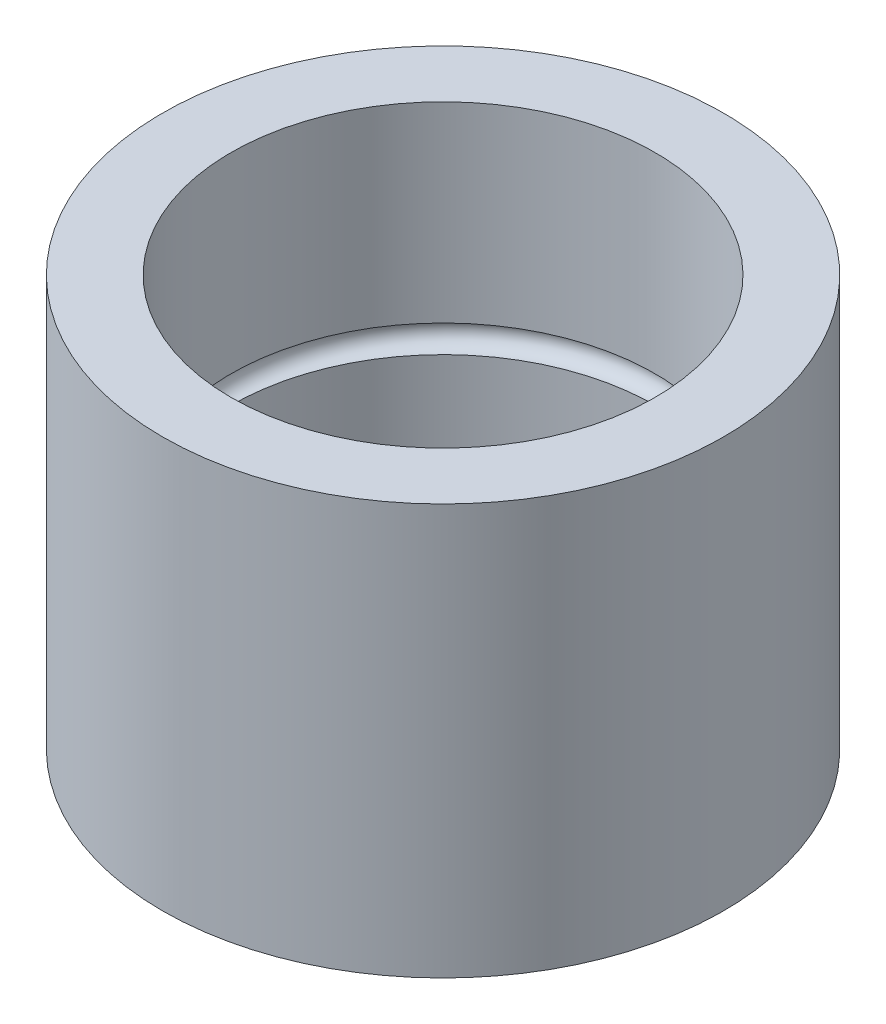
ISO-10303-21;
HEADER;
FILE_DESCRIPTION(('STEP AP214'),'2;1');
FILE_NAME('part.step','',(''),(''),'','','');
FILE_SCHEMA(('AUTOMOTIVE_DESIGN { 1 0 10303 214 1 1 1 1 }'));
ENDSEC;
DATA;
#1=APPLICATION_CONTEXT('core data for automotive mechanical design processes');
#2=APPLICATION_PROTOCOL_DEFINITION('international standard','automotive_design',2000,#1);
#3=PRODUCT_CONTEXT('',#1,'mechanical');
#4=PRODUCT('Part','Part','',(#3));
#5=PRODUCT_RELATED_PRODUCT_CATEGORY('part','',(#4));
#6=PRODUCT_DEFINITION_FORMATION('','',#4);
#7=PRODUCT_DEFINITION_CONTEXT('part definition',#1,'design');
#8=PRODUCT_DEFINITION('design','',#6,#7);
#9=PRODUCT_DEFINITION_SHAPE('','',#8);
#10=(LENGTH_UNIT() NAMED_UNIT(*) SI_UNIT(.MILLI.,.METRE.));
#11=(NAMED_UNIT(*) PLANE_ANGLE_UNIT() SI_UNIT($,.RADIAN.));
#12=(NAMED_UNIT(*) SI_UNIT($,.STERADIAN.) SOLID_ANGLE_UNIT());
#13=UNCERTAINTY_MEASURE_WITH_UNIT(LENGTH_MEASURE(1.E-05),#10,'distance_accuracy_value','');
#14=(GEOMETRIC_REPRESENTATION_CONTEXT(3) GLOBAL_UNCERTAINTY_ASSIGNED_CONTEXT((#13)) GLOBAL_UNIT_ASSIGNED_CONTEXT((#10,
#11,#12)) REPRESENTATION_CONTEXT('',''));
#15=CARTESIAN_POINT('',(0.,0.,0.));
#16=DIRECTION('',(0.,0.,1.));
#17=DIRECTION('',(1.,0.,0.));
#18=AXIS2_PLACEMENT_3D('',#15,#16,#17);
#19=CARTESIAN_POINT('',(0.,15.,0.));
#20=DIRECTION('',(0.,1.,0.));
#21=DIRECTION('',(0.,0.,1.));
#22=AXIS2_PLACEMENT_3D('',#19,#20,#21);
#23=CYLINDRICAL_SURFACE('',#22,15.5);
#24=CARTESIAN_POINT('',(0.,15.,0.));
#25=DIRECTION('',(0.,1.,0.));
#26=DIRECTION('',(0.,0.,1.));
#27=AXIS2_PLACEMENT_3D('',#24,#25,#26);
#28=CIRCLE('',#27,15.5);
#29=CARTESIAN_POINT('',(0.,15.,15.5));
#30=VERTEX_POINT('',#29);
#31=EDGE_CURVE('E10',#30,#30,#28,.T.);
#32=ORIENTED_EDGE('',*,*,#31,.T.);
#33=EDGE_LOOP('',(#32));
#34=FACE_BOUND('',#33,.T.);
#35=CARTESIAN_POINT('',(0.,0.999999999999999,0.));
#36=DIRECTION('',(0.,1.,0.));
#37=DIRECTION('',(0.,0.,1.));
#38=AXIS2_PLACEMENT_3D('',#35,#36,#37);
#39=CIRCLE('',#38,15.5);
#40=CARTESIAN_POINT('',(0.,0.999999999999999,15.5));
#41=VERTEX_POINT('',#40);
#42=EDGE_CURVE('E59',#41,#41,#39,.T.);
#43=ORIENTED_EDGE('',*,*,#42,.F.);
#44=EDGE_LOOP('',(#43));
#45=FACE_BOUND('',#44,.T.);
#46=ADVANCED_FACE('F37',(#34,#45),#23,.F.);
#47=CARTESIAN_POINT('',(-15.5,15.,0.));
#48=DIRECTION('',(0.,1.,0.));
#49=DIRECTION('',(0.,0.,1.));
#50=AXIS2_PLACEMENT_3D('',#47,#48,#49);
#51=PLANE('',#50);
#52=CARTESIAN_POINT('',(0.,15.,0.));
#53=DIRECTION('',(0.,1.,0.));
#54=DIRECTION('',(0.,0.,1.));
#55=AXIS2_PLACEMENT_3D('',#52,#53,#54);
#56=CIRCLE('',#55,20.5);
#57=CARTESIAN_POINT('',(0.,15.,20.5));
#58=VERTEX_POINT('',#57);
#59=EDGE_CURVE('E43',#58,#58,#56,.T.);
#60=ORIENTED_EDGE('',*,*,#59,.T.);
#61=EDGE_LOOP('',(#60));
#62=FACE_BOUND('',#61,.T.);
#63=ORIENTED_EDGE('',*,*,#31,.F.);
#64=EDGE_LOOP('',(#63));
#65=FACE_BOUND('',#64,.T.);
#66=ADVANCED_FACE('F67',(#62,#65),#51,.T.);
#67=CARTESIAN_POINT('',(0.,15.,0.));
#68=DIRECTION('',(0.,1.,0.));
#69=DIRECTION('',(0.,0.,1.));
#70=AXIS2_PLACEMENT_3D('',#67,#68,#69);
#71=CYLINDRICAL_SURFACE('',#70,20.5);
#72=CARTESIAN_POINT('',(0.,-15.,0.));
#73=DIRECTION('',(0.,1.,0.));
#74=DIRECTION('',(0.,0.,1.));
#75=AXIS2_PLACEMENT_3D('',#72,#73,#74);
#76=CIRCLE('',#75,20.5);
#77=CARTESIAN_POINT('',(0.,-15.,20.5));
#78=VERTEX_POINT('',#77);
#79=EDGE_CURVE('E47',#78,#78,#76,.T.);
#80=ORIENTED_EDGE('',*,*,#79,.T.);
#81=EDGE_LOOP('',(#80));
#82=FACE_BOUND('',#81,.T.);
#83=ORIENTED_EDGE('',*,*,#59,.F.);
#84=EDGE_LOOP('',(#83));
#85=FACE_BOUND('',#84,.T.);
#86=ADVANCED_FACE('F71',(#82,#85),#71,.T.);
#87=CARTESIAN_POINT('',(-15.5,-15.,0.));
#88=DIRECTION('',(0.,-1.,0.));
#89=DIRECTION('',(0.,0.,-1.));
#90=AXIS2_PLACEMENT_3D('',#87,#88,#89);
#91=PLANE('',#90);
#92=CARTESIAN_POINT('',(0.,-15.,0.));
#93=DIRECTION('',(0.,1.,0.));
#94=DIRECTION('',(0.,0.,1.));
#95=AXIS2_PLACEMENT_3D('',#92,#93,#94);
#96=CIRCLE('',#95,15.5);
#97=CARTESIAN_POINT('',(0.,-15.,15.5));
#98=VERTEX_POINT('',#97);
#99=EDGE_CURVE('E51',#98,#98,#96,.T.);
#100=ORIENTED_EDGE('',*,*,#99,.T.);
#101=EDGE_LOOP('',(#100));
#102=FACE_BOUND('',#101,.T.);
#103=ORIENTED_EDGE('',*,*,#79,.F.);
#104=EDGE_LOOP('',(#103));
#105=FACE_BOUND('',#104,.T.);
#106=ADVANCED_FACE('F75',(#102,#105),#91,.T.);
#107=CARTESIAN_POINT('',(0.,15.,0.));
#108=DIRECTION('',(0.,1.,0.));
#109=DIRECTION('',(0.,0.,1.));
#110=AXIS2_PLACEMENT_3D('',#107,#108,#109);
#111=CYLINDRICAL_SURFACE('',#110,15.5);
#112=CARTESIAN_POINT('',(0.,-1.,0.));
#113=DIRECTION('',(0.,1.,0.));
#114=DIRECTION('',(0.,0.,1.));
#115=AXIS2_PLACEMENT_3D('',#112,#113,#114);
#116=CIRCLE('',#115,15.5);
#117=CARTESIAN_POINT('',(0.,-1.,15.5));
#118=VERTEX_POINT('',#117);
#119=EDGE_CURVE('E56',#118,#118,#116,.T.);
#120=ORIENTED_EDGE('',*,*,#119,.T.);
#121=EDGE_LOOP('',(#120));
#122=FACE_BOUND('',#121,.T.);
#123=ORIENTED_EDGE('',*,*,#99,.F.);
#124=EDGE_LOOP('',(#123));
#125=FACE_BOUND('',#124,.T.);
#126=ADVANCED_FACE('F82',(#122,#125),#111,.F.);
#127=CARTESIAN_POINT('',(0.,0.,0.));
#128=DIRECTION('',(0.,1.,0.));
#129=DIRECTION('',(0.,0.,1.));
#130=AXIS2_PLACEMENT_3D('',#127,#128,#129);
#131=TOROIDAL_SURFACE('',#130,15.5,1.);
#132=ORIENTED_EDGE('',*,*,#42,.T.);
#133=EDGE_LOOP('',(#132));
#134=FACE_BOUND('',#133,.T.);
#135=ORIENTED_EDGE('',*,*,#119,.F.);
#136=EDGE_LOOP('',(#135));
#137=FACE_BOUND('',#136,.T.);
#138=ADVANCED_FACE('F63',(#134,#137),#131,.F.);
#139=CLOSED_SHELL('',(#46,#66,#86,#106,#126,#138));
#140=MANIFOLD_SOLID_BREP('B2',#139);
#141=ADVANCED_BREP_SHAPE_REPRESENTATION('',(#18,#140),#14);
#142=SHAPE_DEFINITION_REPRESENTATION(#9,#141);
ENDSEC;
END-ISO-10303-21;
